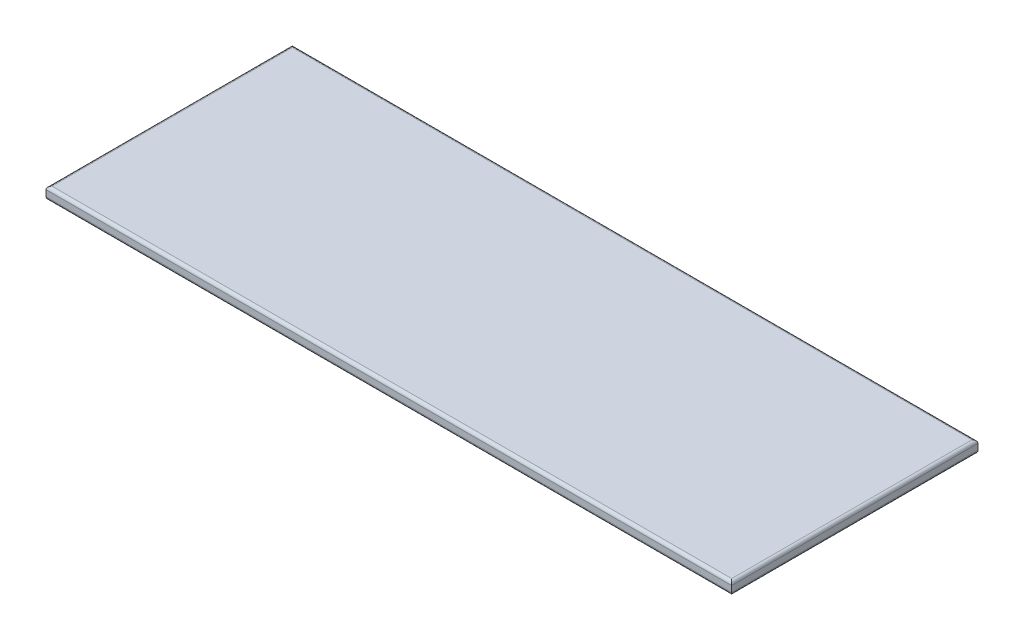
ISO-10303-21;
HEADER;
FILE_DESCRIPTION(('STEP AP214'),'2;1');
FILE_NAME('part.step','',(''),(''),'','','');
FILE_SCHEMA(('AUTOMOTIVE_DESIGN { 1 0 10303 214 1 1 1 1 }'));
ENDSEC;
DATA;
#1=APPLICATION_CONTEXT('core data for automotive mechanical design processes');
#2=APPLICATION_PROTOCOL_DEFINITION('international standard','automotive_design',2000,#1);
#3=PRODUCT_CONTEXT('',#1,'mechanical');
#4=PRODUCT('Part','Part','',(#3));
#5=PRODUCT_RELATED_PRODUCT_CATEGORY('part','',(#4));
#6=PRODUCT_DEFINITION_FORMATION('','',#4);
#7=PRODUCT_DEFINITION_CONTEXT('part definition',#1,'design');
#8=PRODUCT_DEFINITION('design','',#6,#7);
#9=PRODUCT_DEFINITION_SHAPE('','',#8);
#10=(LENGTH_UNIT() NAMED_UNIT(*) SI_UNIT(.MILLI.,.METRE.));
#11=(NAMED_UNIT(*) PLANE_ANGLE_UNIT() SI_UNIT($,.RADIAN.));
#12=(NAMED_UNIT(*) SI_UNIT($,.STERADIAN.) SOLID_ANGLE_UNIT());
#13=UNCERTAINTY_MEASURE_WITH_UNIT(LENGTH_MEASURE(1.E-05),#10,'distance_accuracy_value','');
#14=(GEOMETRIC_REPRESENTATION_CONTEXT(3) GLOBAL_UNCERTAINTY_ASSIGNED_CONTEXT((#13)) GLOBAL_UNIT_ASSIGNED_CONTEXT((#10,
#11,#12)) REPRESENTATION_CONTEXT('',''));
#15=CARTESIAN_POINT('',(0.,0.,0.));
#16=DIRECTION('',(0.,0.,1.));
#17=DIRECTION('',(1.,0.,0.));
#18=AXIS2_PLACEMENT_3D('',#15,#16,#17);
#19=CARTESIAN_POINT('',(0.,2.,0.));
#20=DIRECTION('',(1.,0.,0.));
#21=DIRECTION('',(0.,0.,-1.));
#22=AXIS2_PLACEMENT_3D('',#19,#20,#21);
#23=PLANE('',#22);
#24=DIRECTION('',(0.,-1.,0.));
#25=VECTOR('',#24,1.);
#26=CARTESIAN_POINT('',(0.,2.,0.));
#27=LINE('',#26,#25);
#28=CARTESIAN_POINT('',(0.,1.5,0.));
#29=VERTEX_POINT('',#28);
#30=CARTESIAN_POINT('',(0.,0.5,0.));
#31=VERTEX_POINT('',#30);
#32=EDGE_CURVE('E117',#29,#31,#27,.T.);
#33=ORIENTED_EDGE('',*,*,#32,.F.);
#34=DIRECTION('',(0.,0.,1.));
#35=VECTOR('',#34,1.);
#36=CARTESIAN_POINT('',(0.,1.5,0.));
#37=LINE('',#36,#35);
#38=CARTESIAN_POINT('',(0.,1.5,-40.6));
#39=VERTEX_POINT('',#38);
#40=EDGE_CURVE('E141',#29,#39,#37,.F.);
#41=ORIENTED_EDGE('',*,*,#40,.T.);
#42=DIRECTION('',(0.,-1.,0.));
#43=VECTOR('',#42,1.);
#44=CARTESIAN_POINT('',(0.,2.,-40.6));
#45=LINE('',#44,#43);
#46=CARTESIAN_POINT('',(0.,0.5,-40.6));
#47=VERTEX_POINT('',#46);
#48=EDGE_CURVE('E152',#39,#47,#45,.T.);
#49=ORIENTED_EDGE('',*,*,#48,.T.);
#50=DIRECTION('',(0.,0.,1.));
#51=VECTOR('',#50,1.);
#52=CARTESIAN_POINT('',(0.,0.5,0.));
#53=LINE('',#52,#51);
#54=EDGE_CURVE('E139',#47,#31,#53,.T.);
#55=ORIENTED_EDGE('',*,*,#54,.T.);
#56=EDGE_LOOP('',(#33,#41,#49,#55));
#57=FACE_BOUND('',#56,.T.);
#58=ADVANCED_FACE('F32',(#57),#23,.F.);
#59=CARTESIAN_POINT('',(0.,2.,0.));
#60=DIRECTION('',(0.,0.,-1.));
#61=DIRECTION('',(-1.,0.,0.));
#62=AXIS2_PLACEMENT_3D('',#59,#60,#61);
#63=PLANE('',#62);
#64=DIRECTION('',(0.,-1.,0.));
#65=VECTOR('',#64,1.);
#66=CARTESIAN_POINT('',(113.,2.,0.));
#67=LINE('',#66,#65);
#68=CARTESIAN_POINT('',(113.,1.5,0.));
#69=VERTEX_POINT('',#68);
#70=CARTESIAN_POINT('',(113.,0.5,0.));
#71=VERTEX_POINT('',#70);
#72=EDGE_CURVE('E279',#69,#71,#67,.T.);
#73=ORIENTED_EDGE('',*,*,#72,.F.);
#74=DIRECTION('',(1.,0.,0.));
#75=VECTOR('',#74,1.);
#76=CARTESIAN_POINT('',(0.,1.5,0.));
#77=LINE('',#76,#75);
#78=EDGE_CURVE('E137',#69,#29,#77,.F.);
#79=ORIENTED_EDGE('',*,*,#78,.T.);
#80=ORIENTED_EDGE('',*,*,#32,.T.);
#81=DIRECTION('',(1.,0.,0.));
#82=VECTOR('',#81,1.);
#83=CARTESIAN_POINT('',(113.,0.5,0.));
#84=LINE('',#83,#82);
#85=EDGE_CURVE('E134',#31,#71,#84,.T.);
#86=ORIENTED_EDGE('',*,*,#85,.T.);
#87=EDGE_LOOP('',(#73,#79,#80,#86));
#88=FACE_BOUND('',#87,.T.);
#89=ADVANCED_FACE('F189',(#88),#63,.F.);
#90=CARTESIAN_POINT('',(113.,2.,0.));
#91=DIRECTION('',(-1.,0.,0.));
#92=DIRECTION('',(0.,0.,1.));
#93=AXIS2_PLACEMENT_3D('',#90,#91,#92);
#94=PLANE('',#93);
#95=DIRECTION('',(0.,-1.,0.));
#96=VECTOR('',#95,1.);
#97=CARTESIAN_POINT('',(113.,2.,-40.6));
#98=LINE('',#97,#96);
#99=CARTESIAN_POINT('',(113.,1.5,-40.6));
#100=VERTEX_POINT('',#99);
#101=CARTESIAN_POINT('',(113.,0.5,-40.6));
#102=VERTEX_POINT('',#101);
#103=EDGE_CURVE('E275',#100,#102,#98,.T.);
#104=ORIENTED_EDGE('',*,*,#103,.F.);
#105=DIRECTION('',(0.,0.,-1.));
#106=VECTOR('',#105,1.);
#107=CARTESIAN_POINT('',(113.,1.5,0.));
#108=LINE('',#107,#106);
#109=EDGE_CURVE('E132',#100,#69,#108,.F.);
#110=ORIENTED_EDGE('',*,*,#109,.T.);
#111=ORIENTED_EDGE('',*,*,#72,.T.);
#112=DIRECTION('',(0.,0.,-1.));
#113=VECTOR('',#112,1.);
#114=CARTESIAN_POINT('',(113.,0.5,-40.6));
#115=LINE('',#114,#113);
#116=EDGE_CURVE('E130',#71,#102,#115,.T.);
#117=ORIENTED_EDGE('',*,*,#116,.T.);
#118=EDGE_LOOP('',(#104,#110,#111,#117));
#119=FACE_BOUND('',#118,.T.);
#120=ADVANCED_FACE('F195',(#119),#94,.F.);
#121=CARTESIAN_POINT('',(0.,2.,-40.6));
#122=DIRECTION('',(0.,0.,1.));
#123=DIRECTION('',(1.,0.,0.));
#124=AXIS2_PLACEMENT_3D('',#121,#122,#123);
#125=PLANE('',#124);
#126=ORIENTED_EDGE('',*,*,#48,.F.);
#127=DIRECTION('',(-1.,0.,0.));
#128=VECTOR('',#127,1.);
#129=CARTESIAN_POINT('',(0.,1.5,-40.6));
#130=LINE('',#129,#128);
#131=EDGE_CURVE('E104',#39,#100,#130,.F.);
#132=ORIENTED_EDGE('',*,*,#131,.T.);
#133=ORIENTED_EDGE('',*,*,#103,.T.);
#134=DIRECTION('',(-1.,0.,0.));
#135=VECTOR('',#134,1.);
#136=CARTESIAN_POINT('',(0.,0.5,-40.6));
#137=LINE('',#136,#135);
#138=EDGE_CURVE('E123',#102,#47,#137,.T.);
#139=ORIENTED_EDGE('',*,*,#138,.T.);
#140=EDGE_LOOP('',(#126,#132,#133,#139));
#141=FACE_BOUND('',#140,.T.);
#142=ADVANCED_FACE('F185',(#141),#125,.F.);
#143=CARTESIAN_POINT('',(0.,2.,0.));
#144=DIRECTION('',(0.,-1.,0.));
#145=DIRECTION('',(0.,0.,-1.));
#146=AXIS2_PLACEMENT_3D('',#143,#144,#145);
#147=PLANE('',#146);
#148=DIRECTION('',(0.,0.,-1.));
#149=VECTOR('',#148,1.);
#150=CARTESIAN_POINT('',(112.5,2.,0.));
#151=LINE('',#150,#149);
#152=CARTESIAN_POINT('',(112.5,2.,-0.5));
#153=VERTEX_POINT('',#152);
#154=CARTESIAN_POINT('',(112.5,2.,-40.1));
#155=VERTEX_POINT('',#154);
#156=EDGE_CURVE('E121',#153,#155,#151,.T.);
#157=ORIENTED_EDGE('',*,*,#156,.T.);
#158=DIRECTION('',(-1.,0.,0.));
#159=VECTOR('',#158,1.);
#160=CARTESIAN_POINT('',(0.,2.,-40.1));
#161=LINE('',#160,#159);
#162=CARTESIAN_POINT('',(0.5,2.,-40.1));
#163=VERTEX_POINT('',#162);
#164=EDGE_CURVE('E102',#155,#163,#161,.T.);
#165=ORIENTED_EDGE('',*,*,#164,.T.);
#166=DIRECTION('',(0.,0.,1.));
#167=VECTOR('',#166,1.);
#168=CARTESIAN_POINT('',(0.5,2.,0.));
#169=LINE('',#168,#167);
#170=CARTESIAN_POINT('',(0.5,2.,-0.5));
#171=VERTEX_POINT('',#170);
#172=EDGE_CURVE('E110',#163,#171,#169,.T.);
#173=ORIENTED_EDGE('',*,*,#172,.T.);
#174=DIRECTION('',(1.,0.,0.));
#175=VECTOR('',#174,1.);
#176=CARTESIAN_POINT('',(0.,2.,-0.5));
#177=LINE('',#176,#175);
#178=EDGE_CURVE('E116',#171,#153,#177,.T.);
#179=ORIENTED_EDGE('',*,*,#178,.T.);
#180=EDGE_LOOP('',(#157,#165,#173,#179));
#181=FACE_BOUND('',#180,.T.);
#182=ADVANCED_FACE('F119',(#181),#147,.F.);
#183=CARTESIAN_POINT('',(0.,0.,0.));
#184=DIRECTION('',(0.,-1.,0.));
#185=DIRECTION('',(0.,0.,-1.));
#186=AXIS2_PLACEMENT_3D('',#183,#184,#185);
#187=PLANE('',#186);
#188=DIRECTION('',(0.,0.,-1.));
#189=VECTOR('',#188,1.);
#190=CARTESIAN_POINT('',(112.5,0.,0.));
#191=LINE('',#190,#189);
#192=CARTESIAN_POINT('',(112.5,0.,-40.1));
#193=VERTEX_POINT('',#192);
#194=CARTESIAN_POINT('',(112.5,0.,-0.5));
#195=VERTEX_POINT('',#194);
#196=EDGE_CURVE('E41',#193,#195,#191,.F.);
#197=ORIENTED_EDGE('',*,*,#196,.T.);
#198=DIRECTION('',(1.,0.,0.));
#199=VECTOR('',#198,1.);
#200=CARTESIAN_POINT('',(0.,0.,-0.5));
#201=LINE('',#200,#199);
#202=CARTESIAN_POINT('',(0.5,0.,-0.5));
#203=VERTEX_POINT('',#202);
#204=EDGE_CURVE('E11',#195,#203,#201,.F.);
#205=ORIENTED_EDGE('',*,*,#204,.T.);
#206=DIRECTION('',(0.,0.,1.));
#207=VECTOR('',#206,1.);
#208=CARTESIAN_POINT('',(0.5,0.,-40.6));
#209=LINE('',#208,#207);
#210=CARTESIAN_POINT('',(0.5,0.,-40.1));
#211=VERTEX_POINT('',#210);
#212=EDGE_CURVE('E143',#203,#211,#209,.F.);
#213=ORIENTED_EDGE('',*,*,#212,.T.);
#214=DIRECTION('',(-1.,0.,0.));
#215=VECTOR('',#214,1.);
#216=CARTESIAN_POINT('',(113.,0.,-40.1));
#217=LINE('',#216,#215);
#218=EDGE_CURVE('E52',#211,#193,#217,.F.);
#219=ORIENTED_EDGE('',*,*,#218,.T.);
#220=EDGE_LOOP('',(#197,#205,#213,#219));
#221=FACE_BOUND('',#220,.T.);
#222=ADVANCED_FACE('F174',(#221),#187,.T.);
#223=CARTESIAN_POINT('',(0.,1.5,-0.5));
#224=DIRECTION('',(1.,0.,0.));
#225=DIRECTION('',(0.,0.,-1.));
#226=AXIS2_PLACEMENT_3D('',#223,#224,#225);
#227=CYLINDRICAL_SURFACE('',#226,0.5);
#228=CARTESIAN_POINT('',(0.5,1.5,-0.5));
#229=DIRECTION('',(0.707106781186547,0.,0.707106781186547));
#230=DIRECTION('',(-0.707106781186547,0.,0.707106781186547));
#231=AXIS2_PLACEMENT_3D('',#228,#229,#230);
#232=ELLIPSE('',#231,0.707106781186547,0.5);
#233=EDGE_CURVE('E113',#29,#171,#232,.F.);
#234=ORIENTED_EDGE('',*,*,#233,.F.);
#235=ORIENTED_EDGE('',*,*,#78,.F.);
#236=CARTESIAN_POINT('',(112.5,1.5,-0.5));
#237=DIRECTION('',(0.707106781186547,0.,-0.707106781186547));
#238=DIRECTION('',(0.707106781186547,0.,0.707106781186547));
#239=AXIS2_PLACEMENT_3D('',#236,#237,#238);
#240=ELLIPSE('',#239,0.707106781186547,0.5);
#241=EDGE_CURVE('E149',#153,#69,#240,.T.);
#242=ORIENTED_EDGE('',*,*,#241,.F.);
#243=ORIENTED_EDGE('',*,*,#178,.F.);
#244=EDGE_LOOP('',(#234,#235,#242,#243));
#245=FACE_BOUND('',#244,.T.);
#246=ADVANCED_FACE('F176',(#245),#227,.T.);
#247=CARTESIAN_POINT('',(112.5,1.5,0.));
#248=DIRECTION('',(0.,0.,-1.));
#249=DIRECTION('',(-1.,0.,0.));
#250=AXIS2_PLACEMENT_3D('',#247,#248,#249);
#251=CYLINDRICAL_SURFACE('',#250,0.5);
#252=ORIENTED_EDGE('',*,*,#241,.T.);
#253=ORIENTED_EDGE('',*,*,#109,.F.);
#254=CARTESIAN_POINT('',(112.5,1.5,-40.1));
#255=DIRECTION('',(-0.707106781186547,0.,-0.707106781186547));
#256=DIRECTION('',(0.707106781186547,0.,-0.707106781186547));
#257=AXIS2_PLACEMENT_3D('',#254,#255,#256);
#258=ELLIPSE('',#257,0.707106781186547,0.5);
#259=EDGE_CURVE('E107',#155,#100,#258,.T.);
#260=ORIENTED_EDGE('',*,*,#259,.F.);
#261=ORIENTED_EDGE('',*,*,#156,.F.);
#262=EDGE_LOOP('',(#252,#253,#260,#261));
#263=FACE_BOUND('',#262,.T.);
#264=ADVANCED_FACE('F182',(#263),#251,.T.);
#265=CARTESIAN_POINT('',(0.5,1.5,0.));
#266=DIRECTION('',(0.,0.,1.));
#267=DIRECTION('',(1.,0.,0.));
#268=AXIS2_PLACEMENT_3D('',#265,#266,#267);
#269=CYLINDRICAL_SURFACE('',#268,0.5);
#270=ORIENTED_EDGE('',*,*,#233,.T.);
#271=ORIENTED_EDGE('',*,*,#172,.F.);
#272=CARTESIAN_POINT('',(0.5,1.5,-40.1));
#273=DIRECTION('',(-0.707106781186547,0.,0.707106781186547));
#274=DIRECTION('',(0.707106781186547,0.,0.707106781186547));
#275=AXIS2_PLACEMENT_3D('',#272,#273,#274);
#276=ELLIPSE('',#275,0.707106781186547,0.5);
#277=EDGE_CURVE('E98',#39,#163,#276,.F.);
#278=ORIENTED_EDGE('',*,*,#277,.F.);
#279=ORIENTED_EDGE('',*,*,#40,.F.);
#280=EDGE_LOOP('',(#270,#271,#278,#279));
#281=FACE_BOUND('',#280,.T.);
#282=ADVANCED_FACE('F111',(#281),#269,.T.);
#283=CARTESIAN_POINT('',(0.,1.5,-40.1));
#284=DIRECTION('',(-1.,0.,0.));
#285=DIRECTION('',(0.,0.,1.));
#286=AXIS2_PLACEMENT_3D('',#283,#284,#285);
#287=CYLINDRICAL_SURFACE('',#286,0.5);
#288=ORIENTED_EDGE('',*,*,#259,.T.);
#289=ORIENTED_EDGE('',*,*,#131,.F.);
#290=ORIENTED_EDGE('',*,*,#277,.T.);
#291=ORIENTED_EDGE('',*,*,#164,.F.);
#292=EDGE_LOOP('',(#288,#289,#290,#291));
#293=FACE_BOUND('',#292,.T.);
#294=ADVANCED_FACE('F100',(#293),#287,.T.);
#295=CARTESIAN_POINT('',(0.,0.5,-40.1));
#296=DIRECTION('',(1.,0.,0.));
#297=DIRECTION('',(0.,0.,-1.));
#298=AXIS2_PLACEMENT_3D('',#295,#296,#297);
#299=CYLINDRICAL_SURFACE('',#298,0.5);
#300=CARTESIAN_POINT('',(112.5,0.5,-40.1));
#301=DIRECTION('',(0.707106781186547,0.,0.707106781186547));
#302=DIRECTION('',(0.707106781186547,0.,-0.707106781186547));
#303=AXIS2_PLACEMENT_3D('',#300,#301,#302);
#304=ELLIPSE('',#303,0.707106781186547,0.5);
#305=EDGE_CURVE('E156',#193,#102,#304,.T.);
#306=ORIENTED_EDGE('',*,*,#305,.F.);
#307=ORIENTED_EDGE('',*,*,#218,.F.);
#308=CARTESIAN_POINT('',(0.5,0.5,-40.1));
#309=DIRECTION('',(0.707106781186547,0.,-0.707106781186547));
#310=DIRECTION('',(-0.707106781186547,0.,-0.707106781186547));
#311=AXIS2_PLACEMENT_3D('',#308,#309,#310);
#312=ELLIPSE('',#311,0.707106781186547,0.5);
#313=EDGE_CURVE('E36',#47,#211,#312,.F.);
#314=ORIENTED_EDGE('',*,*,#313,.F.);
#315=ORIENTED_EDGE('',*,*,#138,.F.);
#316=EDGE_LOOP('',(#306,#307,#314,#315));
#317=FACE_BOUND('',#316,.T.);
#318=ADVANCED_FACE('F34',(#317),#299,.T.);
#319=CARTESIAN_POINT('',(0.5,0.5,0.));
#320=DIRECTION('',(0.,0.,-1.));
#321=DIRECTION('',(-1.,0.,0.));
#322=AXIS2_PLACEMENT_3D('',#319,#320,#321);
#323=CYLINDRICAL_SURFACE('',#322,0.5);
#324=ORIENTED_EDGE('',*,*,#313,.T.);
#325=ORIENTED_EDGE('',*,*,#212,.F.);
#326=CARTESIAN_POINT('',(0.5,0.5,-0.5));
#327=DIRECTION('',(-0.707106781186547,0.,-0.707106781186547));
#328=DIRECTION('',(0.707106781186547,0.,-0.707106781186547));
#329=AXIS2_PLACEMENT_3D('',#326,#327,#328);
#330=ELLIPSE('',#329,0.707106781186547,0.5);
#331=EDGE_CURVE('E155',#31,#203,#330,.F.);
#332=ORIENTED_EDGE('',*,*,#331,.F.);
#333=ORIENTED_EDGE('',*,*,#54,.F.);
#334=EDGE_LOOP('',(#324,#325,#332,#333));
#335=FACE_BOUND('',#334,.T.);
#336=ADVANCED_FACE('F165',(#335),#323,.T.);
#337=CARTESIAN_POINT('',(112.5,0.5,0.));
#338=DIRECTION('',(0.,0.,1.));
#339=DIRECTION('',(1.,0.,0.));
#340=AXIS2_PLACEMENT_3D('',#337,#338,#339);
#341=CYLINDRICAL_SURFACE('',#340,0.5);
#342=ORIENTED_EDGE('',*,*,#305,.T.);
#343=ORIENTED_EDGE('',*,*,#116,.F.);
#344=CARTESIAN_POINT('',(112.5,0.5,-0.5));
#345=DIRECTION('',(-0.707106781186547,0.,0.707106781186547));
#346=DIRECTION('',(0.707106781186547,0.,0.707106781186547));
#347=AXIS2_PLACEMENT_3D('',#344,#345,#346);
#348=ELLIPSE('',#347,0.707106781186547,0.5);
#349=EDGE_CURVE('E153',#195,#71,#348,.T.);
#350=ORIENTED_EDGE('',*,*,#349,.F.);
#351=ORIENTED_EDGE('',*,*,#196,.F.);
#352=EDGE_LOOP('',(#342,#343,#350,#351));
#353=FACE_BOUND('',#352,.T.);
#354=ADVANCED_FACE('F170',(#353),#341,.T.);
#355=CARTESIAN_POINT('',(0.,0.5,-0.5));
#356=DIRECTION('',(-1.,0.,0.));
#357=DIRECTION('',(0.,0.,1.));
#358=AXIS2_PLACEMENT_3D('',#355,#356,#357);
#359=CYLINDRICAL_SURFACE('',#358,0.5);
#360=ORIENTED_EDGE('',*,*,#331,.T.);
#361=ORIENTED_EDGE('',*,*,#204,.F.);
#362=ORIENTED_EDGE('',*,*,#349,.T.);
#363=ORIENTED_EDGE('',*,*,#85,.F.);
#364=EDGE_LOOP('',(#360,#361,#362,#363));
#365=FACE_BOUND('',#364,.T.);
#366=ADVANCED_FACE('F173',(#365),#359,.T.);
#367=CLOSED_SHELL('',(#58,#89,#120,#142,#182,#222,#246,#264,#282,#294,#318,#336,#354,#366));
#368=MANIFOLD_SOLID_BREP('B2',#367);
#369=ADVANCED_BREP_SHAPE_REPRESENTATION('',(#18,#368),#14);
#370=SHAPE_DEFINITION_REPRESENTATION(#9,#369);
ENDSEC;
END-ISO-10303-21;
